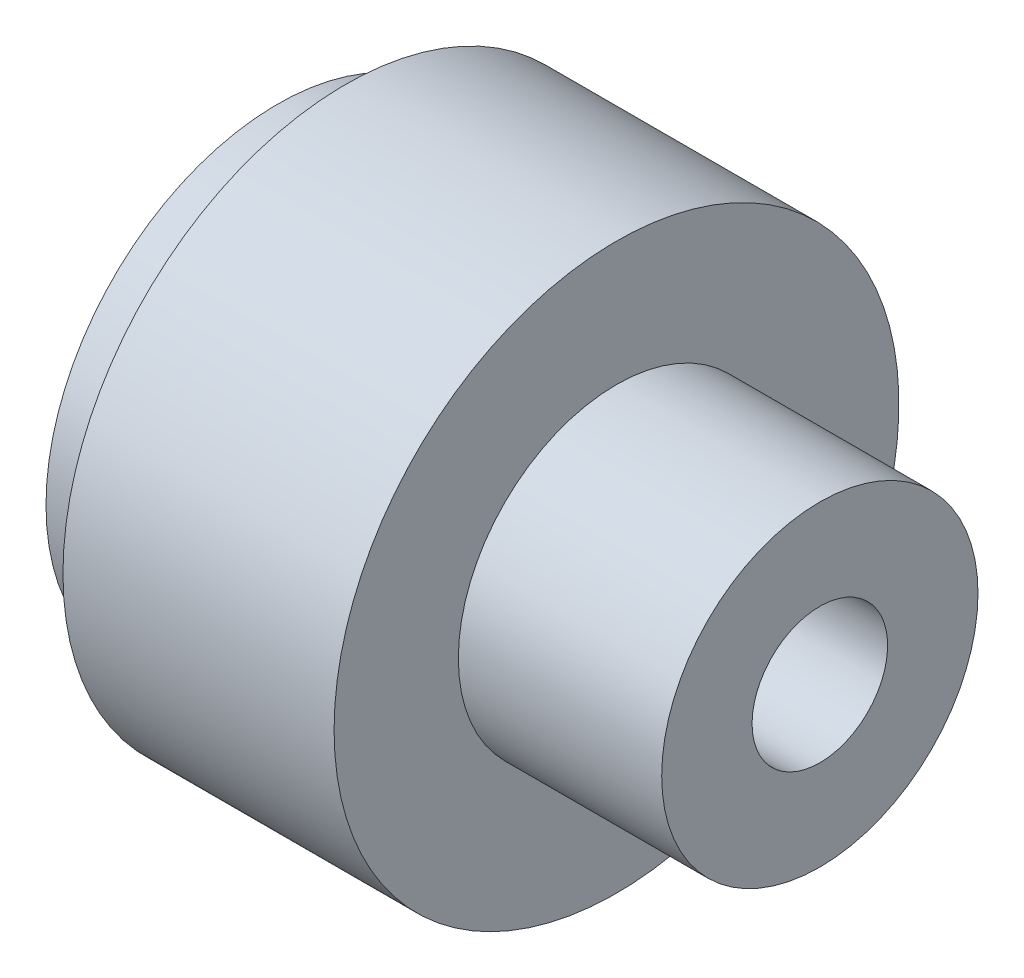
ISO-10303-21;
HEADER;
FILE_DESCRIPTION(('STEP AP214'),'2;1');
FILE_NAME('part.step','',(''),(''),'','','');
FILE_SCHEMA(('AUTOMOTIVE_DESIGN { 1 0 10303 214 1 1 1 1 }'));
ENDSEC;
DATA;
#1=APPLICATION_CONTEXT('core data for automotive mechanical design processes');
#2=APPLICATION_PROTOCOL_DEFINITION('international standard','automotive_design',2000,#1);
#3=PRODUCT_CONTEXT('',#1,'mechanical');
#4=PRODUCT('Part','Part','',(#3));
#5=PRODUCT_RELATED_PRODUCT_CATEGORY('part','',(#4));
#6=PRODUCT_DEFINITION_FORMATION('','',#4);
#7=PRODUCT_DEFINITION_CONTEXT('part definition',#1,'design');
#8=PRODUCT_DEFINITION('design','',#6,#7);
#9=PRODUCT_DEFINITION_SHAPE('','',#8);
#10=(LENGTH_UNIT() NAMED_UNIT(*) SI_UNIT(.MILLI.,.METRE.));
#11=(NAMED_UNIT(*) PLANE_ANGLE_UNIT() SI_UNIT($,.RADIAN.));
#12=(NAMED_UNIT(*) SI_UNIT($,.STERADIAN.) SOLID_ANGLE_UNIT());
#13=UNCERTAINTY_MEASURE_WITH_UNIT(LENGTH_MEASURE(1.E-05),#10,'distance_accuracy_value','');
#14=(GEOMETRIC_REPRESENTATION_CONTEXT(3) GLOBAL_UNCERTAINTY_ASSIGNED_CONTEXT((#13)) GLOBAL_UNIT_ASSIGNED_CONTEXT((#10,
#11,#12)) REPRESENTATION_CONTEXT('',''));
#15=CARTESIAN_POINT('',(0.,0.,0.));
#16=DIRECTION('',(0.,0.,1.));
#17=DIRECTION('',(1.,0.,0.));
#18=AXIS2_PLACEMENT_3D('',#15,#16,#17);
#19=CARTESIAN_POINT('',(0.,10.0800945962899,0.));
#20=DIRECTION('',(-1.,0.,0.));
#21=DIRECTION('',(0.,0.,1.));
#22=AXIS2_PLACEMENT_3D('',#19,#20,#21);
#23=PLANE('',#22);
#24=CARTESIAN_POINT('',(0.,3.08009459628988,0.));
#25=DIRECTION('',(-1.,0.,0.));
#26=DIRECTION('',(0.,0.,1.));
#27=AXIS2_PLACEMENT_3D('',#24,#25,#26);
#28=CIRCLE('',#27,7.);
#29=CARTESIAN_POINT('',(0.,3.08009459628988,7.));
#30=VERTEX_POINT('',#29);
#31=EDGE_CURVE('E65',#30,#30,#28,.T.);
#32=ORIENTED_EDGE('',*,*,#31,.F.);
#33=EDGE_LOOP('',(#32));
#34=FACE_BOUND('',#33,.T.);
#35=CARTESIAN_POINT('',(0.,3.08009459628988,0.));
#36=DIRECTION('',(-1.,0.,0.));
#37=DIRECTION('',(0.,0.,1.));
#38=AXIS2_PLACEMENT_3D('',#35,#36,#37);
#39=CIRCLE('',#38,3.);
#40=CARTESIAN_POINT('',(0.,3.08009459628988,3.));
#41=VERTEX_POINT('',#40);
#42=EDGE_CURVE('E10',#41,#41,#39,.T.);
#43=ORIENTED_EDGE('',*,*,#42,.T.);
#44=EDGE_LOOP('',(#43));
#45=FACE_BOUND('',#44,.T.);
#46=ADVANCED_FACE('F31',(#34,#45),#23,.F.);
#47=CARTESIAN_POINT('',(-14.0625,3.08009459628988,0.));
#48=DIRECTION('',(-1.,0.,0.));
#49=DIRECTION('',(0.,0.,1.));
#50=AXIS2_PLACEMENT_3D('',#47,#48,#49);
#51=CYLINDRICAL_SURFACE('',#50,3.);
#52=ORIENTED_EDGE('',*,*,#42,.F.);
#53=EDGE_LOOP('',(#52));
#54=FACE_BOUND('',#53,.T.);
#55=CARTESIAN_POINT('',(-21.,3.08009459628988,0.));
#56=DIRECTION('',(-1.,0.,0.));
#57=DIRECTION('',(0.,0.,1.));
#58=AXIS2_PLACEMENT_3D('',#55,#56,#57);
#59=CIRCLE('',#58,3.);
#60=CARTESIAN_POINT('',(-21.,3.08009459628988,3.));
#61=VERTEX_POINT('',#60);
#62=EDGE_CURVE('E37',#61,#61,#59,.T.);
#63=ORIENTED_EDGE('',*,*,#62,.T.);
#64=EDGE_LOOP('',(#63));
#65=FACE_BOUND('',#64,.T.);
#66=ADVANCED_FACE('F72',(#54,#65),#51,.F.);
#67=CARTESIAN_POINT('',(-21.,6.08009459628988,0.));
#68=DIRECTION('',(1.,0.,0.));
#69=DIRECTION('',(0.,0.,-1.));
#70=AXIS2_PLACEMENT_3D('',#67,#68,#69);
#71=PLANE('',#70);
#72=ORIENTED_EDGE('',*,*,#62,.F.);
#73=EDGE_LOOP('',(#72));
#74=FACE_BOUND('',#73,.T.);
#75=CARTESIAN_POINT('',(-21.,3.08009459628988,0.));
#76=DIRECTION('',(-1.,0.,0.));
#77=DIRECTION('',(0.,0.,1.));
#78=AXIS2_PLACEMENT_3D('',#75,#76,#77);
#79=CIRCLE('',#78,5.25);
#80=CARTESIAN_POINT('',(-21.,3.08009459628988,5.25));
#81=VERTEX_POINT('',#80);
#82=EDGE_CURVE('E41',#81,#81,#79,.T.);
#83=ORIENTED_EDGE('',*,*,#82,.T.);
#84=EDGE_LOOP('',(#83));
#85=FACE_BOUND('',#84,.T.);
#86=ADVANCED_FACE('F76',(#74,#85),#71,.F.);
#87=CARTESIAN_POINT('',(-14.0625,3.08009459628988,0.));
#88=DIRECTION('',(-1.,0.,0.));
#89=DIRECTION('',(0.,0.,1.));
#90=AXIS2_PLACEMENT_3D('',#87,#88,#89);
#91=CYLINDRICAL_SURFACE('',#90,5.25);
#92=ORIENTED_EDGE('',*,*,#82,.F.);
#93=EDGE_LOOP('',(#92));
#94=FACE_BOUND('',#93,.T.);
#95=CARTESIAN_POINT('',(-24.,3.08009459628988,0.));
#96=DIRECTION('',(-1.,0.,0.));
#97=DIRECTION('',(0.,0.,1.));
#98=AXIS2_PLACEMENT_3D('',#95,#96,#97);
#99=CIRCLE('',#98,5.25);
#100=CARTESIAN_POINT('',(-24.,3.08009459628988,5.25));
#101=VERTEX_POINT('',#100);
#102=EDGE_CURVE('E45',#101,#101,#99,.T.);
#103=ORIENTED_EDGE('',*,*,#102,.T.);
#104=EDGE_LOOP('',(#103));
#105=FACE_BOUND('',#104,.T.);
#106=ADVANCED_FACE('F81',(#94,#105),#91,.F.);
#107=CARTESIAN_POINT('',(-24.,8.33009459628988,0.));
#108=DIRECTION('',(1.,0.,0.));
#109=DIRECTION('',(0.,0.,-1.));
#110=AXIS2_PLACEMENT_3D('',#107,#108,#109);
#111=PLANE('',#110);
#112=ORIENTED_EDGE('',*,*,#102,.F.);
#113=EDGE_LOOP('',(#112));
#114=FACE_BOUND('',#113,.T.);
#115=CARTESIAN_POINT('',(-24.,3.08009459628988,0.));
#116=DIRECTION('',(-1.,0.,0.));
#117=DIRECTION('',(0.,0.,1.));
#118=AXIS2_PLACEMENT_3D('',#115,#116,#117);
#119=CIRCLE('',#118,10.25);
#120=CARTESIAN_POINT('',(-24.,3.08009459628988,10.25));
#121=VERTEX_POINT('',#120);
#122=EDGE_CURVE('E50',#121,#121,#119,.T.);
#123=ORIENTED_EDGE('',*,*,#122,.T.);
#124=EDGE_LOOP('',(#123));
#125=FACE_BOUND('',#124,.T.);
#126=ADVANCED_FACE('F87',(#114,#125),#111,.F.);
#127=CARTESIAN_POINT('',(-14.0625,3.08009459628988,0.));
#128=DIRECTION('',(-1.,0.,0.));
#129=DIRECTION('',(0.,0.,1.));
#130=AXIS2_PLACEMENT_3D('',#127,#128,#129);
#131=CYLINDRICAL_SURFACE('',#130,10.25);
#132=ORIENTED_EDGE('',*,*,#122,.F.);
#133=EDGE_LOOP('',(#132));
#134=FACE_BOUND('',#133,.T.);
#135=CARTESIAN_POINT('',(-21.,3.08009459628988,0.));
#136=DIRECTION('',(-1.,0.,0.));
#137=DIRECTION('',(0.,0.,1.));
#138=AXIS2_PLACEMENT_3D('',#135,#136,#137);
#139=CIRCLE('',#138,10.25);
#140=CARTESIAN_POINT('',(-21.,3.08009459628988,10.25));
#141=VERTEX_POINT('',#140);
#142=EDGE_CURVE('E53',#141,#141,#139,.T.);
#143=ORIENTED_EDGE('',*,*,#142,.T.);
#144=EDGE_LOOP('',(#143));
#145=FACE_BOUND('',#144,.T.);
#146=ADVANCED_FACE('F91',(#134,#145),#131,.T.);
#147=CARTESIAN_POINT('',(-21.,13.3300945962899,0.));
#148=DIRECTION('',(1.,0.,0.));
#149=DIRECTION('',(0.,0.,-1.));
#150=AXIS2_PLACEMENT_3D('',#147,#148,#149);
#151=PLANE('',#150);
#152=ORIENTED_EDGE('',*,*,#142,.F.);
#153=EDGE_LOOP('',(#152));
#154=FACE_BOUND('',#153,.T.);
#155=CARTESIAN_POINT('',(-21.,3.08009459628988,0.));
#156=DIRECTION('',(-1.,0.,0.));
#157=DIRECTION('',(0.,0.,1.));
#158=AXIS2_PLACEMENT_3D('',#155,#156,#157);
#159=CIRCLE('',#158,12.5);
#160=CARTESIAN_POINT('',(-21.,3.08009459628988,12.5));
#161=VERTEX_POINT('',#160);
#162=EDGE_CURVE('E56',#161,#161,#159,.T.);
#163=ORIENTED_EDGE('',*,*,#162,.T.);
#164=EDGE_LOOP('',(#163));
#165=FACE_BOUND('',#164,.T.);
#166=ADVANCED_FACE('F95',(#154,#165),#151,.F.);
#167=CARTESIAN_POINT('',(-14.0625,3.08009459628988,0.));
#168=DIRECTION('',(-1.,0.,0.));
#169=DIRECTION('',(0.,0.,1.));
#170=AXIS2_PLACEMENT_3D('',#167,#168,#169);
#171=CYLINDRICAL_SURFACE('',#170,12.5);
#172=ORIENTED_EDGE('',*,*,#162,.F.);
#173=EDGE_LOOP('',(#172));
#174=FACE_BOUND('',#173,.T.);
#175=CARTESIAN_POINT('',(-9.,3.08009459628988,0.));
#176=DIRECTION('',(-1.,0.,0.));
#177=DIRECTION('',(0.,0.,1.));
#178=AXIS2_PLACEMENT_3D('',#175,#176,#177);
#179=CIRCLE('',#178,12.5);
#180=CARTESIAN_POINT('',(-9.,3.08009459628988,12.5));
#181=VERTEX_POINT('',#180);
#182=EDGE_CURVE('E59',#181,#181,#179,.T.);
#183=ORIENTED_EDGE('',*,*,#182,.T.);
#184=EDGE_LOOP('',(#183));
#185=FACE_BOUND('',#184,.T.);
#186=ADVANCED_FACE('F99',(#174,#185),#171,.T.);
#187=CARTESIAN_POINT('',(-8.99999999999999,15.5800945962899,0.));
#188=DIRECTION('',(-1.,0.,0.));
#189=DIRECTION('',(0.,0.,1.));
#190=AXIS2_PLACEMENT_3D('',#187,#188,#189);
#191=PLANE('',#190);
#192=ORIENTED_EDGE('',*,*,#182,.F.);
#193=EDGE_LOOP('',(#192));
#194=FACE_BOUND('',#193,.T.);
#195=CARTESIAN_POINT('',(-8.99999999999999,3.08009459628988,0.));
#196=DIRECTION('',(-1.,0.,0.));
#197=DIRECTION('',(0.,0.,1.));
#198=AXIS2_PLACEMENT_3D('',#195,#196,#197);
#199=CIRCLE('',#198,7.);
#200=CARTESIAN_POINT('',(-8.99999999999999,3.08009459628988,7.));
#201=VERTEX_POINT('',#200);
#202=EDGE_CURVE('E62',#201,#201,#199,.T.);
#203=ORIENTED_EDGE('',*,*,#202,.T.);
#204=EDGE_LOOP('',(#203));
#205=FACE_BOUND('',#204,.T.);
#206=ADVANCED_FACE('F103',(#194,#205),#191,.F.);
#207=CARTESIAN_POINT('',(-14.0625,3.08009459628988,0.));
#208=DIRECTION('',(-1.,0.,0.));
#209=DIRECTION('',(0.,0.,1.));
#210=AXIS2_PLACEMENT_3D('',#207,#208,#209);
#211=CYLINDRICAL_SURFACE('',#210,7.);
#212=ORIENTED_EDGE('',*,*,#202,.F.);
#213=EDGE_LOOP('',(#212));
#214=FACE_BOUND('',#213,.T.);
#215=ORIENTED_EDGE('',*,*,#31,.T.);
#216=EDGE_LOOP('',(#215));
#217=FACE_BOUND('',#216,.T.);
#218=ADVANCED_FACE('F69',(#214,#217),#211,.T.);
#219=CLOSED_SHELL('',(#46,#66,#86,#106,#126,#146,#166,#186,#206,#218));
#220=MANIFOLD_SOLID_BREP('B2',#219);
#221=ADVANCED_BREP_SHAPE_REPRESENTATION('',(#18,#220),#14);
#222=SHAPE_DEFINITION_REPRESENTATION(#9,#221);
ENDSEC;
END-ISO-10303-21;
